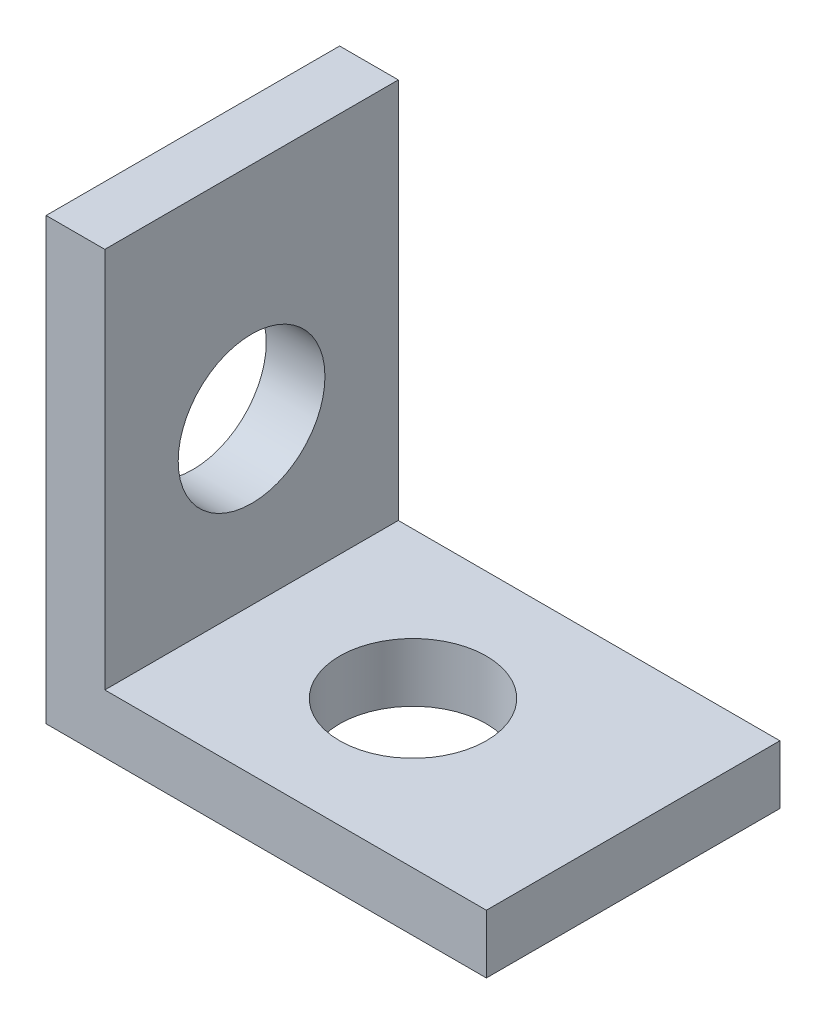
ISO-10303-21;
HEADER;
FILE_DESCRIPTION(('STEP AP214'),'2;1');
FILE_NAME('part.step','',(''),(''),'','','');
FILE_SCHEMA(('AUTOMOTIVE_DESIGN { 1 0 10303 214 1 1 1 1 }'));
ENDSEC;
DATA;
#1=APPLICATION_CONTEXT('core data for automotive mechanical design processes');
#2=APPLICATION_PROTOCOL_DEFINITION('international standard','automotive_design',2000,#1);
#3=PRODUCT_CONTEXT('',#1,'mechanical');
#4=PRODUCT('Part','Part','',(#3));
#5=PRODUCT_RELATED_PRODUCT_CATEGORY('part','',(#4));
#6=PRODUCT_DEFINITION_FORMATION('','',#4);
#7=PRODUCT_DEFINITION_CONTEXT('part definition',#1,'design');
#8=PRODUCT_DEFINITION('design','',#6,#7);
#9=PRODUCT_DEFINITION_SHAPE('','',#8);
#10=(LENGTH_UNIT() NAMED_UNIT(*) SI_UNIT(.MILLI.,.METRE.));
#11=(NAMED_UNIT(*) PLANE_ANGLE_UNIT() SI_UNIT($,.RADIAN.));
#12=(NAMED_UNIT(*) SI_UNIT($,.STERADIAN.) SOLID_ANGLE_UNIT());
#13=UNCERTAINTY_MEASURE_WITH_UNIT(LENGTH_MEASURE(1.E-05),#10,'distance_accuracy_value','');
#14=(GEOMETRIC_REPRESENTATION_CONTEXT(3) GLOBAL_UNCERTAINTY_ASSIGNED_CONTEXT((#13)) GLOBAL_UNIT_ASSIGNED_CONTEXT((#10,
#11,#12)) REPRESENTATION_CONTEXT('',''));
#15=CARTESIAN_POINT('',(0.,0.,0.));
#16=DIRECTION('',(0.,0.,1.));
#17=DIRECTION('',(1.,0.,0.));
#18=AXIS2_PLACEMENT_3D('',#15,#16,#17);
#19=CARTESIAN_POINT('',(0.,13.,10.));
#20=DIRECTION('',(-1.,0.,0.));
#21=DIRECTION('',(0.,-1.,0.));
#22=AXIS2_PLACEMENT_3D('',#19,#20,#21);
#23=PLANE('',#22);
#24=CARTESIAN_POINT('',(0.,5.5,5.));
#25=DIRECTION('',(-1.,0.,0.));
#26=DIRECTION('',(0.,-1.,0.));
#27=AXIS2_PLACEMENT_3D('',#24,#25,#26);
#28=CIRCLE('',#27,2.5);
#29=CARTESIAN_POINT('',(0.,3.,5.));
#30=VERTEX_POINT('',#29);
#31=EDGE_CURVE('E164',#30,#30,#28,.T.);
#32=ORIENTED_EDGE('',*,*,#31,.T.);
#33=EDGE_LOOP('',(#32));
#34=FACE_BOUND('',#33,.T.);
#35=DIRECTION('',(0.,1.,0.));
#36=VECTOR('',#35,1.);
#37=CARTESIAN_POINT('',(0.,13.,0.));
#38=LINE('',#37,#36);
#39=CARTESIAN_POINT('',(0.,0.,0.));
#40=VERTEX_POINT('',#39);
#41=CARTESIAN_POINT('',(0.,13.,0.));
#42=VERTEX_POINT('',#41);
#43=EDGE_CURVE('E120',#40,#42,#38,.T.);
#44=ORIENTED_EDGE('',*,*,#43,.T.);
#45=DIRECTION('',(0.,0.,-1.));
#46=VECTOR('',#45,1.);
#47=CARTESIAN_POINT('',(0.,13.,10.));
#48=LINE('',#47,#46);
#49=CARTESIAN_POINT('',(0.,13.,10.));
#50=VERTEX_POINT('',#49);
#51=EDGE_CURVE('E11',#50,#42,#48,.T.);
#52=ORIENTED_EDGE('',*,*,#51,.F.);
#53=DIRECTION('',(0.,1.,0.));
#54=VECTOR('',#53,1.);
#55=CARTESIAN_POINT('',(0.,13.,10.));
#56=LINE('',#55,#54);
#57=CARTESIAN_POINT('',(0.,0.,10.));
#58=VERTEX_POINT('',#57);
#59=EDGE_CURVE('E130',#58,#50,#56,.T.);
#60=ORIENTED_EDGE('',*,*,#59,.F.);
#61=DIRECTION('',(0.,0.,-1.));
#62=VECTOR('',#61,1.);
#63=CARTESIAN_POINT('',(0.,0.,10.));
#64=LINE('',#63,#62);
#65=EDGE_CURVE('E116',#58,#40,#64,.T.);
#66=ORIENTED_EDGE('',*,*,#65,.T.);
#67=EDGE_LOOP('',(#44,#52,#60,#66));
#68=FACE_BOUND('',#67,.T.);
#69=ADVANCED_FACE('F35',(#34,#68),#23,.F.);
#70=CARTESIAN_POINT('',(-2.,13.,10.));
#71=DIRECTION('',(0.,-1.,0.));
#72=DIRECTION('',(0.,0.,-1.));
#73=AXIS2_PLACEMENT_3D('',#70,#71,#72);
#74=PLANE('',#73);
#75=DIRECTION('',(-1.,0.,0.));
#76=VECTOR('',#75,1.);
#77=CARTESIAN_POINT('',(-2.,13.,0.));
#78=LINE('',#77,#76);
#79=CARTESIAN_POINT('',(-2.,13.,0.));
#80=VERTEX_POINT('',#79);
#81=EDGE_CURVE('E123',#42,#80,#78,.T.);
#82=ORIENTED_EDGE('',*,*,#81,.T.);
#83=DIRECTION('',(0.,0.,-1.));
#84=VECTOR('',#83,1.);
#85=CARTESIAN_POINT('',(-2.,13.,10.));
#86=LINE('',#85,#84);
#87=CARTESIAN_POINT('',(-2.,13.,10.));
#88=VERTEX_POINT('',#87);
#89=EDGE_CURVE('E44',#88,#80,#86,.T.);
#90=ORIENTED_EDGE('',*,*,#89,.F.);
#91=DIRECTION('',(-1.,0.,0.));
#92=VECTOR('',#91,1.);
#93=CARTESIAN_POINT('',(-2.,13.,10.));
#94=LINE('',#93,#92);
#95=EDGE_CURVE('E89',#50,#88,#94,.T.);
#96=ORIENTED_EDGE('',*,*,#95,.F.);
#97=ORIENTED_EDGE('',*,*,#51,.T.);
#98=EDGE_LOOP('',(#82,#90,#96,#97));
#99=FACE_BOUND('',#98,.T.);
#100=ADVANCED_FACE('F157',(#99),#74,.F.);
#101=CARTESIAN_POINT('',(-2.,-2.,10.));
#102=DIRECTION('',(1.,0.,0.));
#103=DIRECTION('',(0.,0.,-1.));
#104=AXIS2_PLACEMENT_3D('',#101,#102,#103);
#105=PLANE('',#104);
#106=CARTESIAN_POINT('',(-2.,5.5,5.));
#107=DIRECTION('',(-1.,0.,0.));
#108=DIRECTION('',(0.,0.,1.));
#109=AXIS2_PLACEMENT_3D('',#106,#107,#108);
#110=CIRCLE('',#109,2.5);
#111=CARTESIAN_POINT('',(-2.,5.5,7.5));
#112=VERTEX_POINT('',#111);
#113=EDGE_CURVE('E167',#112,#112,#110,.T.);
#114=ORIENTED_EDGE('',*,*,#113,.F.);
#115=EDGE_LOOP('',(#114));
#116=FACE_BOUND('',#115,.T.);
#117=DIRECTION('',(0.,-1.,0.));
#118=VECTOR('',#117,1.);
#119=CARTESIAN_POINT('',(-2.,-2.,0.));
#120=LINE('',#119,#118);
#121=CARTESIAN_POINT('',(-2.,-2.,0.));
#122=VERTEX_POINT('',#121);
#123=EDGE_CURVE('E125',#80,#122,#120,.T.);
#124=ORIENTED_EDGE('',*,*,#123,.T.);
#125=DIRECTION('',(0.,0.,-1.));
#126=VECTOR('',#125,1.);
#127=CARTESIAN_POINT('',(-2.,-2.,10.));
#128=LINE('',#127,#126);
#129=CARTESIAN_POINT('',(-2.,-2.,10.));
#130=VERTEX_POINT('',#129);
#131=EDGE_CURVE('E111',#130,#122,#128,.T.);
#132=ORIENTED_EDGE('',*,*,#131,.F.);
#133=DIRECTION('',(0.,-1.,0.));
#134=VECTOR('',#133,1.);
#135=CARTESIAN_POINT('',(-2.,-2.,10.));
#136=LINE('',#135,#134);
#137=EDGE_CURVE('E102',#88,#130,#136,.T.);
#138=ORIENTED_EDGE('',*,*,#137,.F.);
#139=ORIENTED_EDGE('',*,*,#89,.T.);
#140=EDGE_LOOP('',(#124,#132,#138,#139));
#141=FACE_BOUND('',#140,.T.);
#142=ADVANCED_FACE('F137',(#116,#141),#105,.F.);
#143=CARTESIAN_POINT('',(13.,-2.,10.));
#144=DIRECTION('',(0.,1.,0.));
#145=DIRECTION('',(-1.,0.,0.));
#146=AXIS2_PLACEMENT_3D('',#143,#144,#145);
#147=PLANE('',#146);
#148=CARTESIAN_POINT('',(5.5,-2.,5.));
#149=DIRECTION('',(0.,-1.,0.));
#150=DIRECTION('',(1.,0.,0.));
#151=AXIS2_PLACEMENT_3D('',#148,#149,#150);
#152=CIRCLE('',#151,2.5);
#153=CARTESIAN_POINT('',(8.,-2.,5.));
#154=VERTEX_POINT('',#153);
#155=EDGE_CURVE('E166',#154,#154,#152,.T.);
#156=ORIENTED_EDGE('',*,*,#155,.F.);
#157=EDGE_LOOP('',(#156));
#158=FACE_BOUND('',#157,.T.);
#159=DIRECTION('',(1.,0.,0.));
#160=VECTOR('',#159,1.);
#161=CARTESIAN_POINT('',(13.,-2.,0.));
#162=LINE('',#161,#160);
#163=CARTESIAN_POINT('',(13.,-2.,0.));
#164=VERTEX_POINT('',#163);
#165=EDGE_CURVE('E110',#122,#164,#162,.T.);
#166=ORIENTED_EDGE('',*,*,#165,.T.);
#167=DIRECTION('',(0.,0.,-1.));
#168=VECTOR('',#167,1.);
#169=CARTESIAN_POINT('',(13.,-2.,10.));
#170=LINE('',#169,#168);
#171=CARTESIAN_POINT('',(13.,-2.,10.));
#172=VERTEX_POINT('',#171);
#173=EDGE_CURVE('E107',#172,#164,#170,.T.);
#174=ORIENTED_EDGE('',*,*,#173,.F.);
#175=DIRECTION('',(1.,0.,0.));
#176=VECTOR('',#175,1.);
#177=CARTESIAN_POINT('',(13.,-2.,10.));
#178=LINE('',#177,#176);
#179=EDGE_CURVE('E96',#130,#172,#178,.T.);
#180=ORIENTED_EDGE('',*,*,#179,.F.);
#181=ORIENTED_EDGE('',*,*,#131,.T.);
#182=EDGE_LOOP('',(#166,#174,#180,#181));
#183=FACE_BOUND('',#182,.T.);
#184=ADVANCED_FACE('F108',(#158,#183),#147,.F.);
#185=CARTESIAN_POINT('',(13.,0.,10.));
#186=DIRECTION('',(-1.,0.,0.));
#187=DIRECTION('',(0.,0.,1.));
#188=AXIS2_PLACEMENT_3D('',#185,#186,#187);
#189=PLANE('',#188);
#190=DIRECTION('',(0.,1.,0.));
#191=VECTOR('',#190,1.);
#192=CARTESIAN_POINT('',(13.,0.,0.));
#193=LINE('',#192,#191);
#194=CARTESIAN_POINT('',(13.,0.,0.));
#195=VERTEX_POINT('',#194);
#196=EDGE_CURVE('E75',#164,#195,#193,.T.);
#197=ORIENTED_EDGE('',*,*,#196,.T.);
#198=DIRECTION('',(0.,0.,-1.));
#199=VECTOR('',#198,1.);
#200=CARTESIAN_POINT('',(13.,0.,10.));
#201=LINE('',#200,#199);
#202=CARTESIAN_POINT('',(13.,0.,10.));
#203=VERTEX_POINT('',#202);
#204=EDGE_CURVE('E112',#203,#195,#201,.T.);
#205=ORIENTED_EDGE('',*,*,#204,.F.);
#206=DIRECTION('',(0.,1.,0.));
#207=VECTOR('',#206,1.);
#208=CARTESIAN_POINT('',(13.,0.,10.));
#209=LINE('',#208,#207);
#210=EDGE_CURVE('E100',#172,#203,#209,.T.);
#211=ORIENTED_EDGE('',*,*,#210,.F.);
#212=ORIENTED_EDGE('',*,*,#173,.T.);
#213=EDGE_LOOP('',(#197,#205,#211,#212));
#214=FACE_BOUND('',#213,.T.);
#215=ADVANCED_FACE('F114',(#214),#189,.F.);
#216=CARTESIAN_POINT('',(0.,0.,10.));
#217=DIRECTION('',(0.,-1.,0.));
#218=DIRECTION('',(0.,0.,-1.));
#219=AXIS2_PLACEMENT_3D('',#216,#217,#218);
#220=PLANE('',#219);
#221=CARTESIAN_POINT('',(5.5,0.,5.));
#222=DIRECTION('',(0.,-1.,0.));
#223=DIRECTION('',(0.,0.,-1.));
#224=AXIS2_PLACEMENT_3D('',#221,#222,#223);
#225=CIRCLE('',#224,2.5);
#226=CARTESIAN_POINT('',(5.5,0.,2.5));
#227=VERTEX_POINT('',#226);
#228=EDGE_CURVE('E38',#227,#227,#225,.T.);
#229=ORIENTED_EDGE('',*,*,#228,.T.);
#230=EDGE_LOOP('',(#229));
#231=FACE_BOUND('',#230,.T.);
#232=DIRECTION('',(-1.,0.,0.));
#233=VECTOR('',#232,1.);
#234=CARTESIAN_POINT('',(0.,0.,0.));
#235=LINE('',#234,#233);
#236=EDGE_CURVE('E81',#195,#40,#235,.T.);
#237=ORIENTED_EDGE('',*,*,#236,.T.);
#238=ORIENTED_EDGE('',*,*,#65,.F.);
#239=DIRECTION('',(-1.,0.,0.));
#240=VECTOR('',#239,1.);
#241=CARTESIAN_POINT('',(0.,0.,10.));
#242=LINE('',#241,#240);
#243=EDGE_CURVE('E52',#203,#58,#242,.T.);
#244=ORIENTED_EDGE('',*,*,#243,.F.);
#245=ORIENTED_EDGE('',*,*,#204,.T.);
#246=EDGE_LOOP('',(#237,#238,#244,#245));
#247=FACE_BOUND('',#246,.T.);
#248=ADVANCED_FACE('F144',(#231,#247),#220,.F.);
#249=CARTESIAN_POINT('',(0.,0.,10.));
#250=DIRECTION('',(0.,0.,1.));
#251=DIRECTION('',(1.,0.,0.));
#252=AXIS2_PLACEMENT_3D('',#249,#250,#251);
#253=PLANE('',#252);
#254=ORIENTED_EDGE('',*,*,#59,.T.);
#255=ORIENTED_EDGE('',*,*,#95,.T.);
#256=ORIENTED_EDGE('',*,*,#137,.T.);
#257=ORIENTED_EDGE('',*,*,#179,.T.);
#258=ORIENTED_EDGE('',*,*,#210,.T.);
#259=ORIENTED_EDGE('',*,*,#243,.T.);
#260=EDGE_LOOP('',(#254,#255,#256,#257,#258,#259));
#261=FACE_BOUND('',#260,.T.);
#262=ADVANCED_FACE('F98',(#261),#253,.T.);
#263=CARTESIAN_POINT('',(0.,0.,0.));
#264=DIRECTION('',(0.,0.,1.));
#265=DIRECTION('',(1.,0.,0.));
#266=AXIS2_PLACEMENT_3D('',#263,#264,#265);
#267=PLANE('',#266);
#268=ORIENTED_EDGE('',*,*,#43,.F.);
#269=ORIENTED_EDGE('',*,*,#236,.F.);
#270=ORIENTED_EDGE('',*,*,#196,.F.);
#271=ORIENTED_EDGE('',*,*,#165,.F.);
#272=ORIENTED_EDGE('',*,*,#123,.F.);
#273=ORIENTED_EDGE('',*,*,#81,.F.);
#274=EDGE_LOOP('',(#268,#269,#270,#271,#272,#273));
#275=FACE_BOUND('',#274,.T.);
#276=ADVANCED_FACE('F140',(#275),#267,.F.);
#277=CARTESIAN_POINT('',(5.5,8.,5.));
#278=DIRECTION('',(0.,-1.,0.));
#279=DIRECTION('',(1.,0.,0.));
#280=AXIS2_PLACEMENT_3D('',#277,#278,#279);
#281=CYLINDRICAL_SURFACE('',#280,2.5);
#282=ORIENTED_EDGE('',*,*,#155,.T.);
#283=EDGE_LOOP('',(#282));
#284=FACE_BOUND('',#283,.T.);
#285=ORIENTED_EDGE('',*,*,#228,.F.);
#286=EDGE_LOOP('',(#285));
#287=FACE_BOUND('',#286,.T.);
#288=ADVANCED_FACE('F190',(#284,#287),#281,.F.);
#289=CARTESIAN_POINT('',(8.,5.5,5.));
#290=DIRECTION('',(-1.,0.,0.));
#291=DIRECTION('',(0.,0.,1.));
#292=AXIS2_PLACEMENT_3D('',#289,#290,#291);
#293=CYLINDRICAL_SURFACE('',#292,2.5);
#294=ORIENTED_EDGE('',*,*,#113,.T.);
#295=EDGE_LOOP('',(#294));
#296=FACE_BOUND('',#295,.T.);
#297=ORIENTED_EDGE('',*,*,#31,.F.);
#298=EDGE_LOOP('',(#297));
#299=FACE_BOUND('',#298,.T.);
#300=ADVANCED_FACE('F177',(#296,#299),#293,.F.);
#301=CLOSED_SHELL('',(#69,#100,#142,#184,#215,#248,#262,#276,#288,#300));
#302=MANIFOLD_SOLID_BREP('B2',#301);
#303=ADVANCED_BREP_SHAPE_REPRESENTATION('',(#18,#302),#14);
#304=SHAPE_DEFINITION_REPRESENTATION(#9,#303);
ENDSEC;
END-ISO-10303-21;
